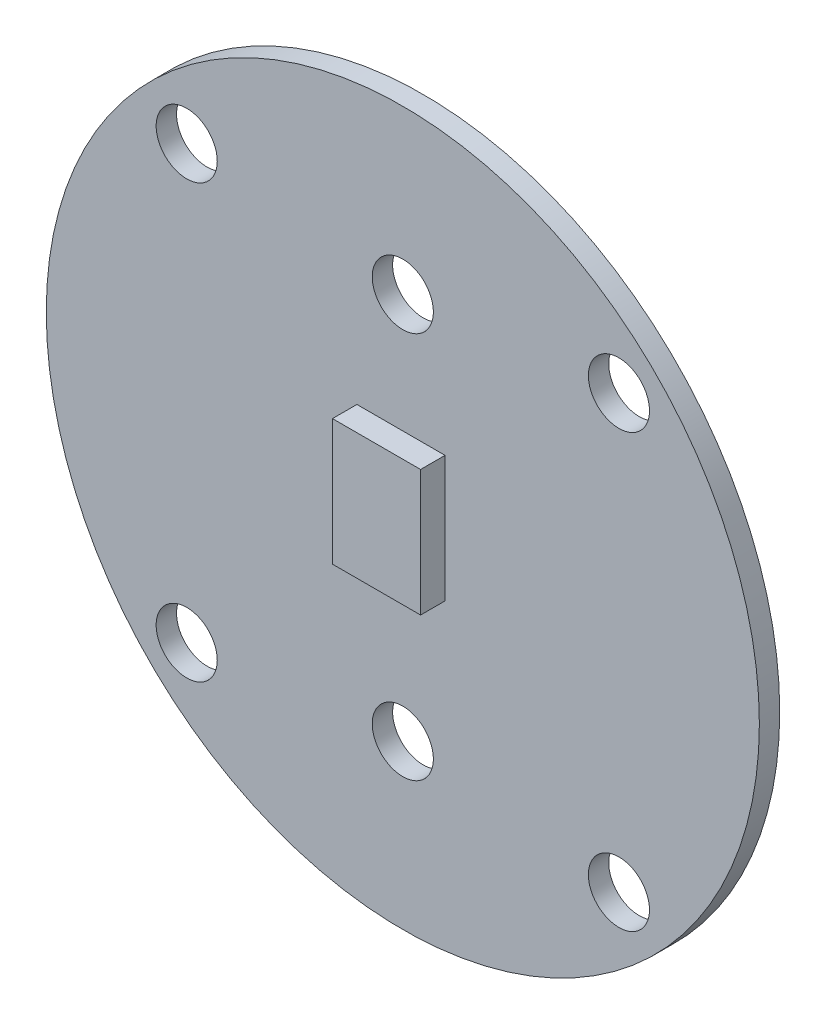
ISO-10303-21;
HEADER;
FILE_DESCRIPTION(('STEP AP214'),'2;1');
FILE_NAME('part.step','',(''),(''),'','','');
FILE_SCHEMA(('AUTOMOTIVE_DESIGN { 1 0 10303 214 1 1 1 1 }'));
ENDSEC;
DATA;
#1=APPLICATION_CONTEXT('core data for automotive mechanical design processes');
#2=APPLICATION_PROTOCOL_DEFINITION('international standard','automotive_design',2000,#1);
#3=PRODUCT_CONTEXT('',#1,'mechanical');
#4=PRODUCT('Part','Part','',(#3));
#5=PRODUCT_RELATED_PRODUCT_CATEGORY('part','',(#4));
#6=PRODUCT_DEFINITION_FORMATION('','',#4);
#7=PRODUCT_DEFINITION_CONTEXT('part definition',#1,'design');
#8=PRODUCT_DEFINITION('design','',#6,#7);
#9=PRODUCT_DEFINITION_SHAPE('','',#8);
#10=(LENGTH_UNIT() NAMED_UNIT(*) SI_UNIT(.MILLI.,.METRE.));
#11=(NAMED_UNIT(*) PLANE_ANGLE_UNIT() SI_UNIT($,.RADIAN.));
#12=(NAMED_UNIT(*) SI_UNIT($,.STERADIAN.) SOLID_ANGLE_UNIT());
#13=UNCERTAINTY_MEASURE_WITH_UNIT(LENGTH_MEASURE(1.E-05),#10,'distance_accuracy_value','');
#14=(GEOMETRIC_REPRESENTATION_CONTEXT(3) GLOBAL_UNCERTAINTY_ASSIGNED_CONTEXT((#13)) GLOBAL_UNIT_ASSIGNED_CONTEXT((#10,
#11,#12)) REPRESENTATION_CONTEXT('',''));
#15=CARTESIAN_POINT('',(0.,0.,0.));
#16=DIRECTION('',(0.,0.,1.));
#17=DIRECTION('',(1.,0.,0.));
#18=AXIS2_PLACEMENT_3D('',#15,#16,#17);
#19=CARTESIAN_POINT('',(0.,0.,1.));
#20=DIRECTION('',(0.,0.,1.));
#21=DIRECTION('',(1.,0.,0.));
#22=AXIS2_PLACEMENT_3D('',#19,#20,#21);
#23=PLANE('',#22);
#24=CARTESIAN_POINT('',(-10.6066017177982,-10.6066017177982,1.));
#25=DIRECTION('',(0.,0.,1.));
#26=DIRECTION('',(1.,0.,0.));
#27=AXIS2_PLACEMENT_3D('',#24,#25,#26);
#28=CIRCLE('',#27,1.5);
#29=CARTESIAN_POINT('',(-9.10660171779823,-10.6066017177982,1.));
#30=VERTEX_POINT('',#29);
#31=EDGE_CURVE('E143',#30,#30,#28,.T.);
#32=ORIENTED_EDGE('',*,*,#31,.F.);
#33=EDGE_LOOP('',(#32));
#34=FACE_BOUND('',#33,.T.);
#35=CARTESIAN_POINT('',(10.6066017177982,10.6066017177983,1.));
#36=DIRECTION('',(0.,0.,1.));
#37=DIRECTION('',(1.,0.,0.));
#38=AXIS2_PLACEMENT_3D('',#35,#36,#37);
#39=CIRCLE('',#38,1.5);
#40=CARTESIAN_POINT('',(12.1066017177982,10.6066017177983,1.));
#41=VERTEX_POINT('',#40);
#42=EDGE_CURVE('E159',#41,#41,#39,.T.);
#43=ORIENTED_EDGE('',*,*,#42,.F.);
#44=EDGE_LOOP('',(#43));
#45=FACE_BOUND('',#44,.T.);
#46=CARTESIAN_POINT('',(0.,9.5,1.));
#47=DIRECTION('',(0.,0.,1.));
#48=DIRECTION('',(1.,0.,0.));
#49=AXIS2_PLACEMENT_3D('',#46,#47,#48);
#50=CIRCLE('',#49,1.5);
#51=CARTESIAN_POINT('',(1.5,9.5,1.));
#52=VERTEX_POINT('',#51);
#53=EDGE_CURVE('E175',#52,#52,#50,.T.);
#54=ORIENTED_EDGE('',*,*,#53,.F.);
#55=EDGE_LOOP('',(#54));
#56=FACE_BOUND('',#55,.T.);
#57=CARTESIAN_POINT('',(0.,0.,1.));
#58=DIRECTION('',(0.,0.,1.));
#59=DIRECTION('',(1.,0.,0.));
#60=AXIS2_PLACEMENT_3D('',#57,#58,#59);
#61=CIRCLE('',#60,17.5);
#62=CARTESIAN_POINT('',(17.5,0.,1.));
#63=VERTEX_POINT('',#62);
#64=EDGE_CURVE('E11',#63,#63,#61,.T.);
#65=ORIENTED_EDGE('',*,*,#64,.T.);
#66=EDGE_LOOP('',(#65));
#67=FACE_BOUND('',#66,.T.);
#68=CARTESIAN_POINT('',(0.,-9.5,1.));
#69=DIRECTION('',(0.,0.,1.));
#70=DIRECTION('',(1.,0.,0.));
#71=AXIS2_PLACEMENT_3D('',#68,#69,#70);
#72=CIRCLE('',#71,1.5);
#73=CARTESIAN_POINT('',(1.5,-9.5,1.));
#74=VERTEX_POINT('',#73);
#75=EDGE_CURVE('E167',#74,#74,#72,.T.);
#76=ORIENTED_EDGE('',*,*,#75,.F.);
#77=EDGE_LOOP('',(#76));
#78=FACE_BOUND('',#77,.T.);
#79=CARTESIAN_POINT('',(10.6066017177982,-10.6066017177982,1.));
#80=DIRECTION('',(0.,0.,1.));
#81=DIRECTION('',(1.,0.,0.));
#82=AXIS2_PLACEMENT_3D('',#79,#80,#81);
#83=CIRCLE('',#82,1.5);
#84=CARTESIAN_POINT('',(12.1066017177982,-10.6066017177982,1.));
#85=VERTEX_POINT('',#84);
#86=EDGE_CURVE('E151',#85,#85,#83,.T.);
#87=ORIENTED_EDGE('',*,*,#86,.F.);
#88=EDGE_LOOP('',(#87));
#89=FACE_BOUND('',#88,.T.);
#90=CARTESIAN_POINT('',(-10.6066017177982,10.6066017177983,1.));
#91=DIRECTION('',(0.,0.,1.));
#92=DIRECTION('',(1.,0.,0.));
#93=AXIS2_PLACEMENT_3D('',#90,#91,#92);
#94=CIRCLE('',#93,1.5);
#95=CARTESIAN_POINT('',(-9.10660171779816,10.6066017177983,1.));
#96=VERTEX_POINT('',#95);
#97=EDGE_CURVE('E135',#96,#96,#94,.T.);
#98=ORIENTED_EDGE('',*,*,#97,.F.);
#99=EDGE_LOOP('',(#98));
#100=FACE_BOUND('',#99,.T.);
#101=DIRECTION('',(1.,0.,0.));
#102=VECTOR('',#101,1.);
#103=CARTESIAN_POINT('',(-2.25266844416287,-2.4929530782069,1.));
#104=LINE('',#103,#102);
#105=CARTESIAN_POINT('',(-2.25266844416287,-2.4929530782069,1.));
#106=VERTEX_POINT('',#105);
#107=CARTESIAN_POINT('',(2.07245496862983,-2.4929530782069,1.));
#108=VERTEX_POINT('',#107);
#109=EDGE_CURVE('E103',#106,#108,#104,.T.);
#110=ORIENTED_EDGE('',*,*,#109,.F.);
#111=DIRECTION('',(0.,-1.,0.));
#112=VECTOR('',#111,1.);
#113=CARTESIAN_POINT('',(-2.25266844416287,3.6943762484271,1.));
#114=LINE('',#113,#112);
#115=CARTESIAN_POINT('',(-2.25266844416287,3.6943762484271,1.));
#116=VERTEX_POINT('',#115);
#117=EDGE_CURVE('E117',#116,#106,#114,.T.);
#118=ORIENTED_EDGE('',*,*,#117,.F.);
#119=DIRECTION('',(-1.,0.,0.));
#120=VECTOR('',#119,1.);
#121=CARTESIAN_POINT('',(-2.25266844416287,3.6943762484271,1.));
#122=LINE('',#121,#120);
#123=CARTESIAN_POINT('',(2.07245496862983,3.6943762484271,1.));
#124=VERTEX_POINT('',#123);
#125=EDGE_CURVE('E83',#124,#116,#122,.T.);
#126=ORIENTED_EDGE('',*,*,#125,.F.);
#127=DIRECTION('',(0.,1.,0.));
#128=VECTOR('',#127,1.);
#129=CARTESIAN_POINT('',(2.07245496862983,3.6943762484271,1.));
#130=LINE('',#129,#128);
#131=EDGE_CURVE('E123',#108,#124,#130,.T.);
#132=ORIENTED_EDGE('',*,*,#131,.F.);
#133=EDGE_LOOP('',(#110,#118,#126,#132));
#134=FACE_BOUND('',#133,.T.);
#135=ADVANCED_FACE('F45',(#34,#45,#56,#67,#78,#89,#100,#134),#23,.T.);
#136=CARTESIAN_POINT('',(0.,0.,0.));
#137=DIRECTION('',(0.,0.,1.));
#138=DIRECTION('',(1.,0.,0.));
#139=AXIS2_PLACEMENT_3D('',#136,#137,#138);
#140=PLANE('',#139);
#141=CARTESIAN_POINT('',(0.,0.,0.));
#142=DIRECTION('',(0.,0.,1.));
#143=DIRECTION('',(1.,0.,0.));
#144=AXIS2_PLACEMENT_3D('',#141,#142,#143);
#145=CIRCLE('',#144,17.5);
#146=CARTESIAN_POINT('',(17.5,0.,0.));
#147=VERTEX_POINT('',#146);
#148=EDGE_CURVE('E49',#147,#147,#145,.T.);
#149=ORIENTED_EDGE('',*,*,#148,.F.);
#150=EDGE_LOOP('',(#149));
#151=FACE_BOUND('',#150,.T.);
#152=CARTESIAN_POINT('',(0.,9.5,0.));
#153=DIRECTION('',(0.,0.,1.));
#154=DIRECTION('',(1.,0.,0.));
#155=AXIS2_PLACEMENT_3D('',#152,#153,#154);
#156=CIRCLE('',#155,1.5);
#157=CARTESIAN_POINT('',(1.5,9.5,0.));
#158=VERTEX_POINT('',#157);
#159=EDGE_CURVE('E171',#158,#158,#156,.T.);
#160=ORIENTED_EDGE('',*,*,#159,.T.);
#161=EDGE_LOOP('',(#160));
#162=FACE_BOUND('',#161,.T.);
#163=CARTESIAN_POINT('',(0.,-9.5,0.));
#164=DIRECTION('',(0.,0.,1.));
#165=DIRECTION('',(1.,0.,0.));
#166=AXIS2_PLACEMENT_3D('',#163,#164,#165);
#167=CIRCLE('',#166,1.5);
#168=CARTESIAN_POINT('',(1.5,-9.5,0.));
#169=VERTEX_POINT('',#168);
#170=EDGE_CURVE('E163',#169,#169,#167,.T.);
#171=ORIENTED_EDGE('',*,*,#170,.T.);
#172=EDGE_LOOP('',(#171));
#173=FACE_BOUND('',#172,.T.);
#174=CARTESIAN_POINT('',(10.6066017177982,10.6066017177983,0.));
#175=DIRECTION('',(0.,0.,1.));
#176=DIRECTION('',(1.,0.,0.));
#177=AXIS2_PLACEMENT_3D('',#174,#175,#176);
#178=CIRCLE('',#177,1.5);
#179=CARTESIAN_POINT('',(12.1066017177982,10.6066017177983,0.));
#180=VERTEX_POINT('',#179);
#181=EDGE_CURVE('E155',#180,#180,#178,.T.);
#182=ORIENTED_EDGE('',*,*,#181,.T.);
#183=EDGE_LOOP('',(#182));
#184=FACE_BOUND('',#183,.T.);
#185=CARTESIAN_POINT('',(10.6066017177982,-10.6066017177982,0.));
#186=DIRECTION('',(0.,0.,1.));
#187=DIRECTION('',(1.,0.,0.));
#188=AXIS2_PLACEMENT_3D('',#185,#186,#187);
#189=CIRCLE('',#188,1.5);
#190=CARTESIAN_POINT('',(12.1066017177982,-10.6066017177982,0.));
#191=VERTEX_POINT('',#190);
#192=EDGE_CURVE('E147',#191,#191,#189,.T.);
#193=ORIENTED_EDGE('',*,*,#192,.T.);
#194=EDGE_LOOP('',(#193));
#195=FACE_BOUND('',#194,.T.);
#196=CARTESIAN_POINT('',(-10.6066017177982,-10.6066017177982,0.));
#197=DIRECTION('',(0.,0.,1.));
#198=DIRECTION('',(1.,0.,0.));
#199=AXIS2_PLACEMENT_3D('',#196,#197,#198);
#200=CIRCLE('',#199,1.5);
#201=CARTESIAN_POINT('',(-9.10660171779823,-10.6066017177982,0.));
#202=VERTEX_POINT('',#201);
#203=EDGE_CURVE('E139',#202,#202,#200,.T.);
#204=ORIENTED_EDGE('',*,*,#203,.T.);
#205=EDGE_LOOP('',(#204));
#206=FACE_BOUND('',#205,.T.);
#207=CARTESIAN_POINT('',(-10.6066017177982,10.6066017177983,0.));
#208=DIRECTION('',(0.,0.,1.));
#209=DIRECTION('',(1.,0.,0.));
#210=AXIS2_PLACEMENT_3D('',#207,#208,#209);
#211=CIRCLE('',#210,1.5);
#212=CARTESIAN_POINT('',(-9.10660171779816,10.6066017177983,0.));
#213=VERTEX_POINT('',#212);
#214=EDGE_CURVE('E134',#213,#213,#211,.T.);
#215=ORIENTED_EDGE('',*,*,#214,.T.);
#216=EDGE_LOOP('',(#215));
#217=FACE_BOUND('',#216,.T.);
#218=ADVANCED_FACE('F183',(#151,#162,#173,#184,#195,#206,#217),#140,.F.);
#219=CARTESIAN_POINT('',(0.,0.,1.));
#220=DIRECTION('',(0.,0.,-1.));
#221=DIRECTION('',(-1.,0.,0.));
#222=AXIS2_PLACEMENT_3D('',#219,#220,#221);
#223=CYLINDRICAL_SURFACE('',#222,17.5);
#224=ORIENTED_EDGE('',*,*,#64,.F.);
#225=EDGE_LOOP('',(#224));
#226=FACE_BOUND('',#225,.T.);
#227=ORIENTED_EDGE('',*,*,#148,.T.);
#228=EDGE_LOOP('',(#227));
#229=FACE_BOUND('',#228,.T.);
#230=ADVANCED_FACE('F47',(#226,#229),#223,.T.);
#231=CARTESIAN_POINT('',(0.,9.5,1.));
#232=DIRECTION('',(0.,0.,-1.));
#233=DIRECTION('',(-1.,0.,0.));
#234=AXIS2_PLACEMENT_3D('',#231,#232,#233);
#235=CYLINDRICAL_SURFACE('',#234,1.5);
#236=ORIENTED_EDGE('',*,*,#53,.T.);
#237=EDGE_LOOP('',(#236));
#238=FACE_BOUND('',#237,.T.);
#239=ORIENTED_EDGE('',*,*,#159,.F.);
#240=EDGE_LOOP('',(#239));
#241=FACE_BOUND('',#240,.T.);
#242=ADVANCED_FACE('F186',(#238,#241),#235,.F.);
#243=CARTESIAN_POINT('',(0.,-9.5,1.));
#244=DIRECTION('',(0.,0.,-1.));
#245=DIRECTION('',(-1.,0.,0.));
#246=AXIS2_PLACEMENT_3D('',#243,#244,#245);
#247=CYLINDRICAL_SURFACE('',#246,1.5);
#248=ORIENTED_EDGE('',*,*,#75,.T.);
#249=EDGE_LOOP('',(#248));
#250=FACE_BOUND('',#249,.T.);
#251=ORIENTED_EDGE('',*,*,#170,.F.);
#252=EDGE_LOOP('',(#251));
#253=FACE_BOUND('',#252,.T.);
#254=ADVANCED_FACE('F188',(#250,#253),#247,.F.);
#255=CARTESIAN_POINT('',(10.6066017177982,10.6066017177983,1.));
#256=DIRECTION('',(0.,0.,-1.));
#257=DIRECTION('',(-1.,0.,0.));
#258=AXIS2_PLACEMENT_3D('',#255,#256,#257);
#259=CYLINDRICAL_SURFACE('',#258,1.5);
#260=ORIENTED_EDGE('',*,*,#42,.T.);
#261=EDGE_LOOP('',(#260));
#262=FACE_BOUND('',#261,.T.);
#263=ORIENTED_EDGE('',*,*,#181,.F.);
#264=EDGE_LOOP('',(#263));
#265=FACE_BOUND('',#264,.T.);
#266=ADVANCED_FACE('F195',(#262,#265),#259,.F.);
#267=CARTESIAN_POINT('',(10.6066017177982,-10.6066017177982,1.));
#268=DIRECTION('',(0.,0.,-1.));
#269=DIRECTION('',(-1.,0.,0.));
#270=AXIS2_PLACEMENT_3D('',#267,#268,#269);
#271=CYLINDRICAL_SURFACE('',#270,1.5);
#272=ORIENTED_EDGE('',*,*,#86,.T.);
#273=EDGE_LOOP('',(#272));
#274=FACE_BOUND('',#273,.T.);
#275=ORIENTED_EDGE('',*,*,#192,.F.);
#276=EDGE_LOOP('',(#275));
#277=FACE_BOUND('',#276,.T.);
#278=ADVANCED_FACE('F244',(#274,#277),#271,.F.);
#279=CARTESIAN_POINT('',(-10.6066017177982,-10.6066017177982,1.));
#280=DIRECTION('',(0.,0.,-1.));
#281=DIRECTION('',(-1.,0.,0.));
#282=AXIS2_PLACEMENT_3D('',#279,#280,#281);
#283=CYLINDRICAL_SURFACE('',#282,1.5);
#284=ORIENTED_EDGE('',*,*,#31,.T.);
#285=EDGE_LOOP('',(#284));
#286=FACE_BOUND('',#285,.T.);
#287=ORIENTED_EDGE('',*,*,#203,.F.);
#288=EDGE_LOOP('',(#287));
#289=FACE_BOUND('',#288,.T.);
#290=ADVANCED_FACE('F240',(#286,#289),#283,.F.);
#291=CARTESIAN_POINT('',(-10.6066017177982,10.6066017177983,1.));
#292=DIRECTION('',(0.,0.,-1.));
#293=DIRECTION('',(-1.,0.,0.));
#294=AXIS2_PLACEMENT_3D('',#291,#292,#293);
#295=CYLINDRICAL_SURFACE('',#294,1.5);
#296=ORIENTED_EDGE('',*,*,#97,.T.);
#297=EDGE_LOOP('',(#296));
#298=FACE_BOUND('',#297,.T.);
#299=ORIENTED_EDGE('',*,*,#214,.F.);
#300=EDGE_LOOP('',(#299));
#301=FACE_BOUND('',#300,.T.);
#302=ADVANCED_FACE('F238',(#298,#301),#295,.F.);
#303=CARTESIAN_POINT('',(-2.25266844416287,3.6943762484271,2.2));
#304=DIRECTION('',(1.,0.,0.));
#305=DIRECTION('',(0.,0.,-1.));
#306=AXIS2_PLACEMENT_3D('',#303,#304,#305);
#307=PLANE('',#306);
#308=ORIENTED_EDGE('',*,*,#117,.T.);
#309=DIRECTION('',(0.,0.,-1.));
#310=VECTOR('',#309,1.);
#311=CARTESIAN_POINT('',(-2.25266844416287,-2.4929530782069,2.2));
#312=LINE('',#311,#310);
#313=CARTESIAN_POINT('',(-2.25266844416287,-2.4929530782069,2.2));
#314=VERTEX_POINT('',#313);
#315=EDGE_CURVE('E107',#314,#106,#312,.T.);
#316=ORIENTED_EDGE('',*,*,#315,.F.);
#317=DIRECTION('',(0.,-1.,0.));
#318=VECTOR('',#317,1.);
#319=CARTESIAN_POINT('',(-2.25266844416287,3.6943762484271,2.2));
#320=LINE('',#319,#318);
#321=CARTESIAN_POINT('',(-2.25266844416287,3.6943762484271,2.2));
#322=VERTEX_POINT('',#321);
#323=EDGE_CURVE('E95',#322,#314,#320,.T.);
#324=ORIENTED_EDGE('',*,*,#323,.F.);
#325=DIRECTION('',(0.,0.,-1.));
#326=VECTOR('',#325,1.);
#327=CARTESIAN_POINT('',(-2.25266844416287,3.6943762484271,2.2));
#328=LINE('',#327,#326);
#329=EDGE_CURVE('E113',#322,#116,#328,.T.);
#330=ORIENTED_EDGE('',*,*,#329,.T.);
#331=EDGE_LOOP('',(#308,#316,#324,#330));
#332=FACE_BOUND('',#331,.T.);
#333=ADVANCED_FACE('F224',(#332),#307,.F.);
#334=CARTESIAN_POINT('',(-2.25266844416287,-2.4929530782069,2.2));
#335=DIRECTION('',(0.,1.,0.));
#336=DIRECTION('',(0.,0.,1.));
#337=AXIS2_PLACEMENT_3D('',#334,#335,#336);
#338=PLANE('',#337);
#339=ORIENTED_EDGE('',*,*,#109,.T.);
#340=DIRECTION('',(0.,0.,-1.));
#341=VECTOR('',#340,1.);
#342=CARTESIAN_POINT('',(2.07245496862983,-2.4929530782069,2.2));
#343=LINE('',#342,#341);
#344=CARTESIAN_POINT('',(2.07245496862983,-2.4929530782069,2.2));
#345=VERTEX_POINT('',#344);
#346=EDGE_CURVE('E100',#345,#108,#343,.T.);
#347=ORIENTED_EDGE('',*,*,#346,.F.);
#348=DIRECTION('',(1.,0.,0.));
#349=VECTOR('',#348,1.);
#350=CARTESIAN_POINT('',(-2.25266844416287,-2.4929530782069,2.2));
#351=LINE('',#350,#349);
#352=EDGE_CURVE('E90',#314,#345,#351,.T.);
#353=ORIENTED_EDGE('',*,*,#352,.F.);
#354=ORIENTED_EDGE('',*,*,#315,.T.);
#355=EDGE_LOOP('',(#339,#347,#353,#354));
#356=FACE_BOUND('',#355,.T.);
#357=ADVANCED_FACE('F101',(#356),#338,.F.);
#358=CARTESIAN_POINT('',(2.07245496862983,3.6943762484271,2.2));
#359=DIRECTION('',(-1.,0.,0.));
#360=DIRECTION('',(0.,0.,1.));
#361=AXIS2_PLACEMENT_3D('',#358,#359,#360);
#362=PLANE('',#361);
#363=ORIENTED_EDGE('',*,*,#131,.T.);
#364=DIRECTION('',(0.,0.,-1.));
#365=VECTOR('',#364,1.);
#366=CARTESIAN_POINT('',(2.07245496862983,3.6943762484271,2.2));
#367=LINE('',#366,#365);
#368=CARTESIAN_POINT('',(2.07245496862983,3.6943762484271,2.2));
#369=VERTEX_POINT('',#368);
#370=EDGE_CURVE('E61',#369,#124,#367,.T.);
#371=ORIENTED_EDGE('',*,*,#370,.F.);
#372=DIRECTION('',(0.,1.,0.));
#373=VECTOR('',#372,1.);
#374=CARTESIAN_POINT('',(2.07245496862983,3.6943762484271,2.2));
#375=LINE('',#374,#373);
#376=EDGE_CURVE('E93',#345,#369,#375,.T.);
#377=ORIENTED_EDGE('',*,*,#376,.F.);
#378=ORIENTED_EDGE('',*,*,#346,.T.);
#379=EDGE_LOOP('',(#363,#371,#377,#378));
#380=FACE_BOUND('',#379,.T.);
#381=ADVANCED_FACE('F109',(#380),#362,.F.);
#382=CARTESIAN_POINT('',(-2.25266844416287,3.6943762484271,2.2));
#383=DIRECTION('',(0.,-1.,0.));
#384=DIRECTION('',(0.,0.,-1.));
#385=AXIS2_PLACEMENT_3D('',#382,#383,#384);
#386=PLANE('',#385);
#387=ORIENTED_EDGE('',*,*,#125,.T.);
#388=ORIENTED_EDGE('',*,*,#329,.F.);
#389=DIRECTION('',(-1.,0.,0.));
#390=VECTOR('',#389,1.);
#391=CARTESIAN_POINT('',(-2.25266844416287,3.6943762484271,2.2));
#392=LINE('',#391,#390);
#393=EDGE_CURVE('E69',#369,#322,#392,.T.);
#394=ORIENTED_EDGE('',*,*,#393,.F.);
#395=ORIENTED_EDGE('',*,*,#370,.T.);
#396=EDGE_LOOP('',(#387,#388,#394,#395));
#397=FACE_BOUND('',#396,.T.);
#398=ADVANCED_FACE('F225',(#397),#386,.F.);
#399=CARTESIAN_POINT('',(0.,0.,2.2));
#400=DIRECTION('',(0.,0.,1.));
#401=DIRECTION('',(1.,0.,0.));
#402=AXIS2_PLACEMENT_3D('',#399,#400,#401);
#403=PLANE('',#402);
#404=ORIENTED_EDGE('',*,*,#323,.T.);
#405=ORIENTED_EDGE('',*,*,#352,.T.);
#406=ORIENTED_EDGE('',*,*,#376,.T.);
#407=ORIENTED_EDGE('',*,*,#393,.T.);
#408=EDGE_LOOP('',(#404,#405,#406,#407));
#409=FACE_BOUND('',#408,.T.);
#410=ADVANCED_FACE('F91',(#409),#403,.T.);
#411=CLOSED_SHELL('',(#135,#218,#230,#242,#254,#266,#278,#290,#302,#333,#357,#381,#398,#410));
#412=MANIFOLD_SOLID_BREP('B2',#411);
#413=ADVANCED_BREP_SHAPE_REPRESENTATION('',(#18,#412),#14);
#414=SHAPE_DEFINITION_REPRESENTATION(#9,#413);
ENDSEC;
END-ISO-10303-21;
